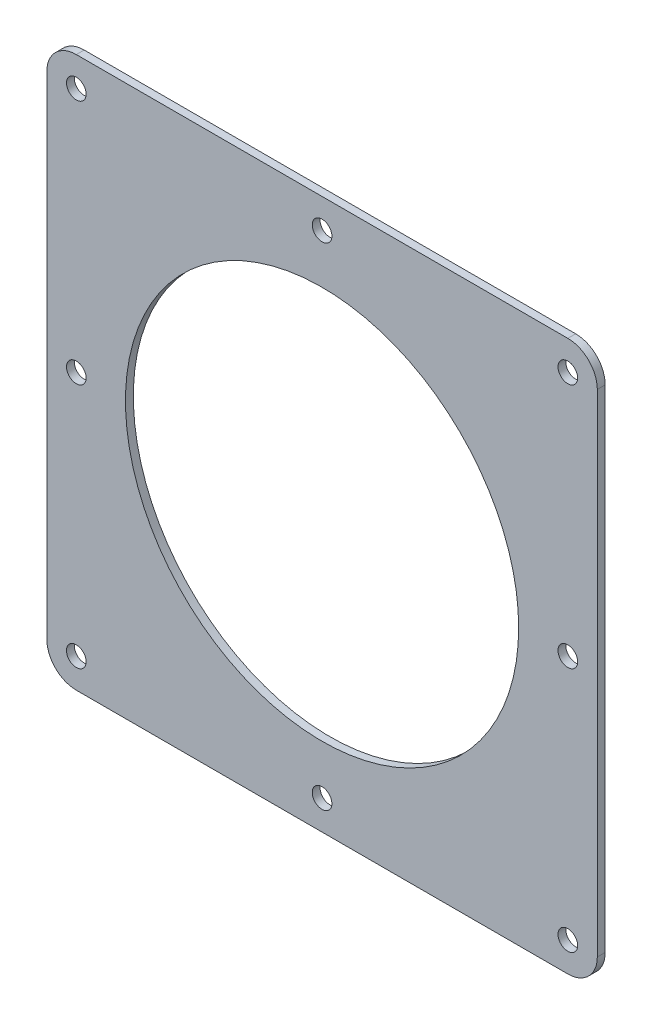
ISO-10303-21;
HEADER;
FILE_DESCRIPTION(('STEP AP214'),'2;1');
FILE_NAME('part.step','',(''),(''),'','','');
FILE_SCHEMA(('AUTOMOTIVE_DESIGN { 1 0 10303 214 1 1 1 1 }'));
ENDSEC;
DATA;
#1=APPLICATION_CONTEXT('core data for automotive mechanical design processes');
#2=APPLICATION_PROTOCOL_DEFINITION('international standard','automotive_design',2000,#1);
#3=PRODUCT_CONTEXT('',#1,'mechanical');
#4=PRODUCT('Part','Part','',(#3));
#5=PRODUCT_RELATED_PRODUCT_CATEGORY('part','',(#4));
#6=PRODUCT_DEFINITION_FORMATION('','',#4);
#7=PRODUCT_DEFINITION_CONTEXT('part definition',#1,'design');
#8=PRODUCT_DEFINITION('design','',#6,#7);
#9=PRODUCT_DEFINITION_SHAPE('','',#8);
#10=(LENGTH_UNIT() NAMED_UNIT(*) SI_UNIT(.MILLI.,.METRE.));
#11=(NAMED_UNIT(*) PLANE_ANGLE_UNIT() SI_UNIT($,.RADIAN.));
#12=(NAMED_UNIT(*) SI_UNIT($,.STERADIAN.) SOLID_ANGLE_UNIT());
#13=UNCERTAINTY_MEASURE_WITH_UNIT(LENGTH_MEASURE(1.E-05),#10,'distance_accuracy_value','');
#14=(GEOMETRIC_REPRESENTATION_CONTEXT(3) GLOBAL_UNCERTAINTY_ASSIGNED_CONTEXT((#13)) GLOBAL_UNIT_ASSIGNED_CONTEXT((#10,
#11,#12)) REPRESENTATION_CONTEXT('',''));
#15=CARTESIAN_POINT('',(0.,0.,0.));
#16=DIRECTION('',(0.,0.,1.));
#17=DIRECTION('',(1.,0.,0.));
#18=AXIS2_PLACEMENT_3D('',#15,#16,#17);
#19=CARTESIAN_POINT('',(-125.,-125.,4.));
#20=DIRECTION('',(0.,0.,1.));
#21=DIRECTION('',(1.,0.,0.));
#22=AXIS2_PLACEMENT_3D('',#19,#20,#21);
#23=PLANE('',#22);
#24=CARTESIAN_POINT('',(0.,0.,4.));
#25=DIRECTION('',(0.,0.,1.));
#26=DIRECTION('',(1.,0.,0.));
#27=AXIS2_PLACEMENT_3D('',#24,#25,#26);
#28=CIRCLE('',#27,100.);
#29=CARTESIAN_POINT('',(100.,0.,4.));
#30=VERTEX_POINT('',#29);
#31=EDGE_CURVE('E228',#30,#30,#28,.T.);
#32=ORIENTED_EDGE('',*,*,#31,.F.);
#33=EDGE_LOOP('',(#32));
#34=FACE_BOUND('',#33,.T.);
#35=CARTESIAN_POINT('',(0.,-125.,4.));
#36=DIRECTION('',(0.,0.,1.));
#37=DIRECTION('',(1.,0.,0.));
#38=AXIS2_PLACEMENT_3D('',#35,#36,#37);
#39=CIRCLE('',#38,5.);
#40=CARTESIAN_POINT('',(5.,-125.,4.));
#41=VERTEX_POINT('',#40);
#42=EDGE_CURVE('E214',#41,#41,#39,.T.);
#43=ORIENTED_EDGE('',*,*,#42,.F.);
#44=EDGE_LOOP('',(#43));
#45=FACE_BOUND('',#44,.T.);
#46=CARTESIAN_POINT('',(125.,0.,4.));
#47=DIRECTION('',(0.,0.,1.));
#48=DIRECTION('',(1.,0.,0.));
#49=AXIS2_PLACEMENT_3D('',#46,#47,#48);
#50=CIRCLE('',#49,5.00000000000001);
#51=CARTESIAN_POINT('',(130.,0.,4.));
#52=VERTEX_POINT('',#51);
#53=EDGE_CURVE('E196',#52,#52,#50,.T.);
#54=ORIENTED_EDGE('',*,*,#53,.F.);
#55=EDGE_LOOP('',(#54));
#56=FACE_BOUND('',#55,.T.);
#57=CARTESIAN_POINT('',(0.,125.,4.));
#58=DIRECTION('',(0.,0.,1.));
#59=DIRECTION('',(1.,0.,0.));
#60=AXIS2_PLACEMENT_3D('',#57,#58,#59);
#61=CIRCLE('',#60,5.);
#62=CARTESIAN_POINT('',(4.99999999999999,125.,4.));
#63=VERTEX_POINT('',#62);
#64=EDGE_CURVE('E184',#63,#63,#61,.T.);
#65=ORIENTED_EDGE('',*,*,#64,.F.);
#66=EDGE_LOOP('',(#65));
#67=FACE_BOUND('',#66,.T.);
#68=CARTESIAN_POINT('',(-125.,-125.,4.));
#69=DIRECTION('',(0.,0.,1.));
#70=DIRECTION('',(1.,0.,0.));
#71=AXIS2_PLACEMENT_3D('',#68,#69,#70);
#72=CIRCLE('',#71,15.);
#73=CARTESIAN_POINT('',(-140.,-125.,4.));
#74=VERTEX_POINT('',#73);
#75=CARTESIAN_POINT('',(-125.,-140.,4.));
#76=VERTEX_POINT('',#75);
#77=EDGE_CURVE('E146',#74,#76,#72,.T.);
#78=ORIENTED_EDGE('',*,*,#77,.T.);
#79=DIRECTION('',(1.,0.,0.));
#80=VECTOR('',#79,1.);
#81=CARTESIAN_POINT('',(-125.,-140.,4.));
#82=LINE('',#81,#80);
#83=CARTESIAN_POINT('',(125.,-140.,4.));
#84=VERTEX_POINT('',#83);
#85=EDGE_CURVE('E94',#76,#84,#82,.T.);
#86=ORIENTED_EDGE('',*,*,#85,.T.);
#87=CARTESIAN_POINT('',(125.,-125.,4.));
#88=DIRECTION('',(0.,0.,1.));
#89=DIRECTION('',(1.,0.,0.));
#90=AXIS2_PLACEMENT_3D('',#87,#88,#89);
#91=CIRCLE('',#90,15.);
#92=CARTESIAN_POINT('',(140.,-125.,4.));
#93=VERTEX_POINT('',#92);
#94=EDGE_CURVE('E162',#84,#93,#91,.T.);
#95=ORIENTED_EDGE('',*,*,#94,.T.);
#96=DIRECTION('',(0.,1.,0.));
#97=VECTOR('',#96,1.);
#98=CARTESIAN_POINT('',(140.,125.,4.));
#99=LINE('',#98,#97);
#100=CARTESIAN_POINT('',(140.,125.,4.));
#101=VERTEX_POINT('',#100);
#102=EDGE_CURVE('E175',#93,#101,#99,.T.);
#103=ORIENTED_EDGE('',*,*,#102,.T.);
#104=CARTESIAN_POINT('',(125.,125.,4.));
#105=DIRECTION('',(0.,0.,1.));
#106=DIRECTION('',(-1.,0.,0.));
#107=AXIS2_PLACEMENT_3D('',#104,#105,#106);
#108=CIRCLE('',#107,15.);
#109=CARTESIAN_POINT('',(125.,140.,4.));
#110=VERTEX_POINT('',#109);
#111=EDGE_CURVE('E113',#101,#110,#108,.T.);
#112=ORIENTED_EDGE('',*,*,#111,.T.);
#113=DIRECTION('',(-1.,0.,0.));
#114=VECTOR('',#113,1.);
#115=CARTESIAN_POINT('',(-125.,140.,4.));
#116=LINE('',#115,#114);
#117=CARTESIAN_POINT('',(-125.,140.,4.));
#118=VERTEX_POINT('',#117);
#119=EDGE_CURVE('E107',#110,#118,#116,.T.);
#120=ORIENTED_EDGE('',*,*,#119,.T.);
#121=CARTESIAN_POINT('',(-125.,125.,4.));
#122=DIRECTION('',(0.,0.,1.));
#123=DIRECTION('',(1.,0.,0.));
#124=AXIS2_PLACEMENT_3D('',#121,#122,#123);
#125=CIRCLE('',#124,15.);
#126=CARTESIAN_POINT('',(-140.,125.,4.));
#127=VERTEX_POINT('',#126);
#128=EDGE_CURVE('E111',#118,#127,#125,.T.);
#129=ORIENTED_EDGE('',*,*,#128,.T.);
#130=DIRECTION('',(0.,-1.,0.));
#131=VECTOR('',#130,1.);
#132=CARTESIAN_POINT('',(-140.,125.,4.));
#133=LINE('',#132,#131);
#134=EDGE_CURVE('E51',#127,#74,#133,.T.);
#135=ORIENTED_EDGE('',*,*,#134,.T.);
#136=EDGE_LOOP('',(#78,#86,#95,#103,#112,#120,#129,#135));
#137=FACE_BOUND('',#136,.T.);
#138=CARTESIAN_POINT('',(-125.,125.,4.));
#139=DIRECTION('',(0.,0.,1.));
#140=DIRECTION('',(1.,0.,0.));
#141=AXIS2_PLACEMENT_3D('',#138,#139,#140);
#142=CIRCLE('',#141,5.00000000000001);
#143=CARTESIAN_POINT('',(-120.,125.,4.));
#144=VERTEX_POINT('',#143);
#145=EDGE_CURVE('E135',#144,#144,#142,.T.);
#146=ORIENTED_EDGE('',*,*,#145,.F.);
#147=EDGE_LOOP('',(#146));
#148=FACE_BOUND('',#147,.T.);
#149=CARTESIAN_POINT('',(125.,125.,4.));
#150=DIRECTION('',(0.,0.,1.));
#151=DIRECTION('',(1.,0.,0.));
#152=AXIS2_PLACEMENT_3D('',#149,#150,#151);
#153=CIRCLE('',#152,4.99999999999999);
#154=CARTESIAN_POINT('',(130.,125.,4.));
#155=VERTEX_POINT('',#154);
#156=EDGE_CURVE('E190',#155,#155,#153,.T.);
#157=ORIENTED_EDGE('',*,*,#156,.F.);
#158=EDGE_LOOP('',(#157));
#159=FACE_BOUND('',#158,.T.);
#160=CARTESIAN_POINT('',(-125.,0.,4.));
#161=DIRECTION('',(0.,0.,1.));
#162=DIRECTION('',(1.,0.,0.));
#163=AXIS2_PLACEMENT_3D('',#160,#161,#162);
#164=CIRCLE('',#163,5.);
#165=CARTESIAN_POINT('',(-120.,0.,4.));
#166=VERTEX_POINT('',#165);
#167=EDGE_CURVE('E202',#166,#166,#164,.T.);
#168=ORIENTED_EDGE('',*,*,#167,.F.);
#169=EDGE_LOOP('',(#168));
#170=FACE_BOUND('',#169,.T.);
#171=CARTESIAN_POINT('',(-125.,-125.,4.));
#172=DIRECTION('',(0.,0.,1.));
#173=DIRECTION('',(1.,0.,0.));
#174=AXIS2_PLACEMENT_3D('',#171,#172,#173);
#175=CIRCLE('',#174,5.00000000000001);
#176=CARTESIAN_POINT('',(-120.,-125.,4.));
#177=VERTEX_POINT('',#176);
#178=EDGE_CURVE('E208',#177,#177,#175,.T.);
#179=ORIENTED_EDGE('',*,*,#178,.F.);
#180=EDGE_LOOP('',(#179));
#181=FACE_BOUND('',#180,.T.);
#182=CARTESIAN_POINT('',(125.,-125.,4.));
#183=DIRECTION('',(0.,0.,1.));
#184=DIRECTION('',(1.,0.,0.));
#185=AXIS2_PLACEMENT_3D('',#182,#183,#184);
#186=CIRCLE('',#185,5.00000000000002);
#187=CARTESIAN_POINT('',(130.,-125.,4.));
#188=VERTEX_POINT('',#187);
#189=EDGE_CURVE('E220',#188,#188,#186,.T.);
#190=ORIENTED_EDGE('',*,*,#189,.F.);
#191=EDGE_LOOP('',(#190));
#192=FACE_BOUND('',#191,.T.);
#193=ADVANCED_FACE('F33',(#34,#45,#56,#67,#137,#148,#159,#170,#181,#192),#23,.T.);
#194=CARTESIAN_POINT('',(-125.,-125.,0.));
#195=DIRECTION('',(0.,0.,1.));
#196=DIRECTION('',(1.,0.,0.));
#197=AXIS2_PLACEMENT_3D('',#194,#195,#196);
#198=PLANE('',#197);
#199=CARTESIAN_POINT('',(0.,0.,0.));
#200=DIRECTION('',(0.,0.,1.));
#201=DIRECTION('',(1.,0.,0.));
#202=AXIS2_PLACEMENT_3D('',#199,#200,#201);
#203=CIRCLE('',#202,100.);
#204=CARTESIAN_POINT('',(100.,0.,0.));
#205=VERTEX_POINT('',#204);
#206=EDGE_CURVE('E37',#205,#205,#203,.T.);
#207=ORIENTED_EDGE('',*,*,#206,.T.);
#208=EDGE_LOOP('',(#207));
#209=FACE_BOUND('',#208,.T.);
#210=CARTESIAN_POINT('',(-125.,-125.,0.));
#211=DIRECTION('',(0.,0.,1.));
#212=DIRECTION('',(1.,0.,0.));
#213=AXIS2_PLACEMENT_3D('',#210,#211,#212);
#214=CIRCLE('',#213,15.);
#215=CARTESIAN_POINT('',(-140.,-125.,0.));
#216=VERTEX_POINT('',#215);
#217=CARTESIAN_POINT('',(-125.,-140.,0.));
#218=VERTEX_POINT('',#217);
#219=EDGE_CURVE('E131',#216,#218,#214,.T.);
#220=ORIENTED_EDGE('',*,*,#219,.F.);
#221=DIRECTION('',(0.,-1.,0.));
#222=VECTOR('',#221,1.);
#223=CARTESIAN_POINT('',(-140.,125.,0.));
#224=LINE('',#223,#222);
#225=CARTESIAN_POINT('',(-140.,125.,0.));
#226=VERTEX_POINT('',#225);
#227=EDGE_CURVE('E86',#226,#216,#224,.T.);
#228=ORIENTED_EDGE('',*,*,#227,.F.);
#229=CARTESIAN_POINT('',(-125.,125.,0.));
#230=DIRECTION('',(0.,0.,1.));
#231=DIRECTION('',(1.,0.,0.));
#232=AXIS2_PLACEMENT_3D('',#229,#230,#231);
#233=CIRCLE('',#232,15.);
#234=CARTESIAN_POINT('',(-125.,140.,0.));
#235=VERTEX_POINT('',#234);
#236=EDGE_CURVE('E80',#235,#226,#233,.T.);
#237=ORIENTED_EDGE('',*,*,#236,.F.);
#238=DIRECTION('',(-1.,0.,0.));
#239=VECTOR('',#238,1.);
#240=CARTESIAN_POINT('',(-125.,140.,0.));
#241=LINE('',#240,#239);
#242=CARTESIAN_POINT('',(125.,140.,0.));
#243=VERTEX_POINT('',#242);
#244=EDGE_CURVE('E121',#243,#235,#241,.T.);
#245=ORIENTED_EDGE('',*,*,#244,.F.);
#246=CARTESIAN_POINT('',(125.,125.,0.));
#247=DIRECTION('',(0.,0.,1.));
#248=DIRECTION('',(-1.,0.,0.));
#249=AXIS2_PLACEMENT_3D('',#246,#247,#248);
#250=CIRCLE('',#249,15.);
#251=CARTESIAN_POINT('',(140.,125.,0.));
#252=VERTEX_POINT('',#251);
#253=EDGE_CURVE('E141',#252,#243,#250,.T.);
#254=ORIENTED_EDGE('',*,*,#253,.F.);
#255=DIRECTION('',(0.,1.,0.));
#256=VECTOR('',#255,1.);
#257=CARTESIAN_POINT('',(140.,125.,0.));
#258=LINE('',#257,#256);
#259=CARTESIAN_POINT('',(140.,-125.,0.));
#260=VERTEX_POINT('',#259);
#261=EDGE_CURVE('E139',#260,#252,#258,.T.);
#262=ORIENTED_EDGE('',*,*,#261,.F.);
#263=CARTESIAN_POINT('',(125.,-125.,0.));
#264=DIRECTION('',(0.,0.,1.));
#265=DIRECTION('',(1.,0.,0.));
#266=AXIS2_PLACEMENT_3D('',#263,#264,#265);
#267=CIRCLE('',#266,15.);
#268=CARTESIAN_POINT('',(125.,-140.,0.));
#269=VERTEX_POINT('',#268);
#270=EDGE_CURVE('E137',#269,#260,#267,.T.);
#271=ORIENTED_EDGE('',*,*,#270,.F.);
#272=DIRECTION('',(1.,0.,0.));
#273=VECTOR('',#272,1.);
#274=CARTESIAN_POINT('',(-125.,-140.,0.));
#275=LINE('',#274,#273);
#276=EDGE_CURVE('E134',#218,#269,#275,.T.);
#277=ORIENTED_EDGE('',*,*,#276,.F.);
#278=EDGE_LOOP('',(#220,#228,#237,#245,#254,#262,#271,#277));
#279=FACE_BOUND('',#278,.T.);
#280=CARTESIAN_POINT('',(-125.,125.,0.));
#281=DIRECTION('',(0.,0.,1.));
#282=DIRECTION('',(1.,0.,0.));
#283=AXIS2_PLACEMENT_3D('',#280,#281,#282);
#284=CIRCLE('',#283,5.00000000000001);
#285=CARTESIAN_POINT('',(-120.,125.,0.));
#286=VERTEX_POINT('',#285);
#287=EDGE_CURVE('E181',#286,#286,#284,.T.);
#288=ORIENTED_EDGE('',*,*,#287,.T.);
#289=EDGE_LOOP('',(#288));
#290=FACE_BOUND('',#289,.T.);
#291=CARTESIAN_POINT('',(0.,125.,0.));
#292=DIRECTION('',(0.,0.,1.));
#293=DIRECTION('',(1.,0.,0.));
#294=AXIS2_PLACEMENT_3D('',#291,#292,#293);
#295=CIRCLE('',#294,5.);
#296=CARTESIAN_POINT('',(4.99999999999999,125.,0.));
#297=VERTEX_POINT('',#296);
#298=EDGE_CURVE('E187',#297,#297,#295,.T.);
#299=ORIENTED_EDGE('',*,*,#298,.T.);
#300=EDGE_LOOP('',(#299));
#301=FACE_BOUND('',#300,.T.);
#302=CARTESIAN_POINT('',(125.,125.,0.));
#303=DIRECTION('',(0.,0.,1.));
#304=DIRECTION('',(1.,0.,0.));
#305=AXIS2_PLACEMENT_3D('',#302,#303,#304);
#306=CIRCLE('',#305,4.99999999999999);
#307=CARTESIAN_POINT('',(130.,125.,0.));
#308=VERTEX_POINT('',#307);
#309=EDGE_CURVE('E193',#308,#308,#306,.T.);
#310=ORIENTED_EDGE('',*,*,#309,.T.);
#311=EDGE_LOOP('',(#310));
#312=FACE_BOUND('',#311,.T.);
#313=CARTESIAN_POINT('',(125.,0.,0.));
#314=DIRECTION('',(0.,0.,1.));
#315=DIRECTION('',(1.,0.,0.));
#316=AXIS2_PLACEMENT_3D('',#313,#314,#315);
#317=CIRCLE('',#316,5.00000000000001);
#318=CARTESIAN_POINT('',(130.,0.,0.));
#319=VERTEX_POINT('',#318);
#320=EDGE_CURVE('E199',#319,#319,#317,.T.);
#321=ORIENTED_EDGE('',*,*,#320,.T.);
#322=EDGE_LOOP('',(#321));
#323=FACE_BOUND('',#322,.T.);
#324=CARTESIAN_POINT('',(-125.,0.,0.));
#325=DIRECTION('',(0.,0.,1.));
#326=DIRECTION('',(1.,0.,0.));
#327=AXIS2_PLACEMENT_3D('',#324,#325,#326);
#328=CIRCLE('',#327,5.);
#329=CARTESIAN_POINT('',(-120.,0.,0.));
#330=VERTEX_POINT('',#329);
#331=EDGE_CURVE('E205',#330,#330,#328,.T.);
#332=ORIENTED_EDGE('',*,*,#331,.T.);
#333=EDGE_LOOP('',(#332));
#334=FACE_BOUND('',#333,.T.);
#335=CARTESIAN_POINT('',(-125.,-125.,0.));
#336=DIRECTION('',(0.,0.,1.));
#337=DIRECTION('',(1.,0.,0.));
#338=AXIS2_PLACEMENT_3D('',#335,#336,#337);
#339=CIRCLE('',#338,5.00000000000001);
#340=CARTESIAN_POINT('',(-120.,-125.,0.));
#341=VERTEX_POINT('',#340);
#342=EDGE_CURVE('E211',#341,#341,#339,.T.);
#343=ORIENTED_EDGE('',*,*,#342,.T.);
#344=EDGE_LOOP('',(#343));
#345=FACE_BOUND('',#344,.T.);
#346=CARTESIAN_POINT('',(0.,-125.,0.));
#347=DIRECTION('',(0.,0.,1.));
#348=DIRECTION('',(1.,0.,0.));
#349=AXIS2_PLACEMENT_3D('',#346,#347,#348);
#350=CIRCLE('',#349,5.);
#351=CARTESIAN_POINT('',(5.,-125.,0.));
#352=VERTEX_POINT('',#351);
#353=EDGE_CURVE('E217',#352,#352,#350,.T.);
#354=ORIENTED_EDGE('',*,*,#353,.T.);
#355=EDGE_LOOP('',(#354));
#356=FACE_BOUND('',#355,.T.);
#357=CARTESIAN_POINT('',(125.,-125.,0.));
#358=DIRECTION('',(0.,0.,1.));
#359=DIRECTION('',(1.,0.,0.));
#360=AXIS2_PLACEMENT_3D('',#357,#358,#359);
#361=CIRCLE('',#360,5.00000000000002);
#362=CARTESIAN_POINT('',(130.,-125.,0.));
#363=VERTEX_POINT('',#362);
#364=EDGE_CURVE('E223',#363,#363,#361,.T.);
#365=ORIENTED_EDGE('',*,*,#364,.T.);
#366=EDGE_LOOP('',(#365));
#367=FACE_BOUND('',#366,.T.);
#368=ADVANCED_FACE('F166',(#209,#279,#290,#301,#312,#323,#334,#345,#356,#367),#198,.F.);
#369=CARTESIAN_POINT('',(-125.,-125.,4.));
#370=DIRECTION('',(0.,0.,-1.));
#371=DIRECTION('',(-1.,0.,0.));
#372=AXIS2_PLACEMENT_3D('',#369,#370,#371);
#373=CYLINDRICAL_SURFACE('',#372,15.);
#374=ORIENTED_EDGE('',*,*,#219,.T.);
#375=DIRECTION('',(0.,0.,-1.));
#376=VECTOR('',#375,1.);
#377=CARTESIAN_POINT('',(-125.,-140.,4.));
#378=LINE('',#377,#376);
#379=EDGE_CURVE('E11',#76,#218,#378,.T.);
#380=ORIENTED_EDGE('',*,*,#379,.F.);
#381=ORIENTED_EDGE('',*,*,#77,.F.);
#382=DIRECTION('',(0.,0.,-1.));
#383=VECTOR('',#382,1.);
#384=CARTESIAN_POINT('',(-140.,-125.,4.));
#385=LINE('',#384,#383);
#386=EDGE_CURVE('E127',#74,#216,#385,.T.);
#387=ORIENTED_EDGE('',*,*,#386,.T.);
#388=EDGE_LOOP('',(#374,#380,#381,#387));
#389=FACE_BOUND('',#388,.T.);
#390=ADVANCED_FACE('F35',(#389),#373,.T.);
#391=CARTESIAN_POINT('',(-125.,-140.,4.));
#392=DIRECTION('',(0.,1.,0.));
#393=DIRECTION('',(0.,0.,1.));
#394=AXIS2_PLACEMENT_3D('',#391,#392,#393);
#395=PLANE('',#394);
#396=ORIENTED_EDGE('',*,*,#276,.T.);
#397=DIRECTION('',(0.,0.,-1.));
#398=VECTOR('',#397,1.);
#399=CARTESIAN_POINT('',(125.,-140.,4.));
#400=LINE('',#399,#398);
#401=EDGE_CURVE('E43',#84,#269,#400,.T.);
#402=ORIENTED_EDGE('',*,*,#401,.F.);
#403=ORIENTED_EDGE('',*,*,#85,.F.);
#404=ORIENTED_EDGE('',*,*,#379,.T.);
#405=EDGE_LOOP('',(#396,#402,#403,#404));
#406=FACE_BOUND('',#405,.T.);
#407=ADVANCED_FACE('F270',(#406),#395,.F.);
#408=CARTESIAN_POINT('',(125.,-125.,4.));
#409=DIRECTION('',(0.,0.,-1.));
#410=DIRECTION('',(-1.,0.,0.));
#411=AXIS2_PLACEMENT_3D('',#408,#409,#410);
#412=CYLINDRICAL_SURFACE('',#411,15.);
#413=ORIENTED_EDGE('',*,*,#270,.T.);
#414=DIRECTION('',(0.,0.,-1.));
#415=VECTOR('',#414,1.);
#416=CARTESIAN_POINT('',(140.,-125.,4.));
#417=LINE('',#416,#415);
#418=EDGE_CURVE('E153',#93,#260,#417,.T.);
#419=ORIENTED_EDGE('',*,*,#418,.F.);
#420=ORIENTED_EDGE('',*,*,#94,.F.);
#421=ORIENTED_EDGE('',*,*,#401,.T.);
#422=EDGE_LOOP('',(#413,#419,#420,#421));
#423=FACE_BOUND('',#422,.T.);
#424=ADVANCED_FACE('F160',(#423),#412,.T.);
#425=CARTESIAN_POINT('',(140.,125.,4.));
#426=DIRECTION('',(-1.,0.,0.));
#427=DIRECTION('',(0.,0.,1.));
#428=AXIS2_PLACEMENT_3D('',#425,#426,#427);
#429=PLANE('',#428);
#430=ORIENTED_EDGE('',*,*,#261,.T.);
#431=DIRECTION('',(0.,0.,-1.));
#432=VECTOR('',#431,1.);
#433=CARTESIAN_POINT('',(140.,125.,4.));
#434=LINE('',#433,#432);
#435=EDGE_CURVE('E150',#101,#252,#434,.T.);
#436=ORIENTED_EDGE('',*,*,#435,.F.);
#437=ORIENTED_EDGE('',*,*,#102,.F.);
#438=ORIENTED_EDGE('',*,*,#418,.T.);
#439=EDGE_LOOP('',(#430,#436,#437,#438));
#440=FACE_BOUND('',#439,.T.);
#441=ADVANCED_FACE('F171',(#440),#429,.F.);
#442=CARTESIAN_POINT('',(125.,125.,4.));
#443=DIRECTION('',(0.,0.,-1.));
#444=DIRECTION('',(-1.,0.,0.));
#445=AXIS2_PLACEMENT_3D('',#442,#443,#444);
#446=CYLINDRICAL_SURFACE('',#445,15.);
#447=ORIENTED_EDGE('',*,*,#253,.T.);
#448=DIRECTION('',(0.,0.,-1.));
#449=VECTOR('',#448,1.);
#450=CARTESIAN_POINT('',(125.,140.,4.));
#451=LINE('',#450,#449);
#452=EDGE_CURVE('E122',#110,#243,#451,.T.);
#453=ORIENTED_EDGE('',*,*,#452,.F.);
#454=ORIENTED_EDGE('',*,*,#111,.F.);
#455=ORIENTED_EDGE('',*,*,#435,.T.);
#456=EDGE_LOOP('',(#447,#453,#454,#455));
#457=FACE_BOUND('',#456,.T.);
#458=ADVANCED_FACE('F174',(#457),#446,.T.);
#459=CARTESIAN_POINT('',(-125.,140.,4.));
#460=DIRECTION('',(0.,-1.,0.));
#461=DIRECTION('',(0.,0.,-1.));
#462=AXIS2_PLACEMENT_3D('',#459,#460,#461);
#463=PLANE('',#462);
#464=ORIENTED_EDGE('',*,*,#244,.T.);
#465=DIRECTION('',(0.,0.,-1.));
#466=VECTOR('',#465,1.);
#467=CARTESIAN_POINT('',(-125.,140.,4.));
#468=LINE('',#467,#466);
#469=EDGE_CURVE('E118',#118,#235,#468,.T.);
#470=ORIENTED_EDGE('',*,*,#469,.F.);
#471=ORIENTED_EDGE('',*,*,#119,.F.);
#472=ORIENTED_EDGE('',*,*,#452,.T.);
#473=EDGE_LOOP('',(#464,#470,#471,#472));
#474=FACE_BOUND('',#473,.T.);
#475=ADVANCED_FACE('F119',(#474),#463,.F.);
#476=CARTESIAN_POINT('',(-125.,125.,4.));
#477=DIRECTION('',(0.,0.,-1.));
#478=DIRECTION('',(-1.,0.,0.));
#479=AXIS2_PLACEMENT_3D('',#476,#477,#478);
#480=CYLINDRICAL_SURFACE('',#479,15.);
#481=ORIENTED_EDGE('',*,*,#236,.T.);
#482=DIRECTION('',(0.,0.,-1.));
#483=VECTOR('',#482,1.);
#484=CARTESIAN_POINT('',(-140.,125.,4.));
#485=LINE('',#484,#483);
#486=EDGE_CURVE('E123',#127,#226,#485,.T.);
#487=ORIENTED_EDGE('',*,*,#486,.F.);
#488=ORIENTED_EDGE('',*,*,#128,.F.);
#489=ORIENTED_EDGE('',*,*,#469,.T.);
#490=EDGE_LOOP('',(#481,#487,#488,#489));
#491=FACE_BOUND('',#490,.T.);
#492=ADVANCED_FACE('F125',(#491),#480,.T.);
#493=CARTESIAN_POINT('',(-140.,125.,4.));
#494=DIRECTION('',(1.,0.,0.));
#495=DIRECTION('',(0.,0.,-1.));
#496=AXIS2_PLACEMENT_3D('',#493,#494,#495);
#497=PLANE('',#496);
#498=ORIENTED_EDGE('',*,*,#227,.T.);
#499=ORIENTED_EDGE('',*,*,#386,.F.);
#500=ORIENTED_EDGE('',*,*,#134,.F.);
#501=ORIENTED_EDGE('',*,*,#486,.T.);
#502=EDGE_LOOP('',(#498,#499,#500,#501));
#503=FACE_BOUND('',#502,.T.);
#504=ADVANCED_FACE('F258',(#503),#497,.F.);
#505=CARTESIAN_POINT('',(-125.,125.,4.));
#506=DIRECTION('',(0.,0.,-1.));
#507=DIRECTION('',(-1.,0.,0.));
#508=AXIS2_PLACEMENT_3D('',#505,#506,#507);
#509=CYLINDRICAL_SURFACE('',#508,5.00000000000001);
#510=ORIENTED_EDGE('',*,*,#145,.T.);
#511=EDGE_LOOP('',(#510));
#512=FACE_BOUND('',#511,.T.);
#513=ORIENTED_EDGE('',*,*,#287,.F.);
#514=EDGE_LOOP('',(#513));
#515=FACE_BOUND('',#514,.T.);
#516=ADVANCED_FACE('F255',(#512,#515),#509,.F.);
#517=CARTESIAN_POINT('',(0.,125.,4.));
#518=DIRECTION('',(0.,0.,-1.));
#519=DIRECTION('',(-1.,0.,0.));
#520=AXIS2_PLACEMENT_3D('',#517,#518,#519);
#521=CYLINDRICAL_SURFACE('',#520,5.);
#522=ORIENTED_EDGE('',*,*,#64,.T.);
#523=EDGE_LOOP('',(#522));
#524=FACE_BOUND('',#523,.T.);
#525=ORIENTED_EDGE('',*,*,#298,.F.);
#526=EDGE_LOOP('',(#525));
#527=FACE_BOUND('',#526,.T.);
#528=ADVANCED_FACE('F341',(#524,#527),#521,.F.);
#529=CARTESIAN_POINT('',(125.,125.,4.));
#530=DIRECTION('',(0.,0.,-1.));
#531=DIRECTION('',(-1.,0.,0.));
#532=AXIS2_PLACEMENT_3D('',#529,#530,#531);
#533=CYLINDRICAL_SURFACE('',#532,4.99999999999999);
#534=ORIENTED_EDGE('',*,*,#156,.T.);
#535=EDGE_LOOP('',(#534));
#536=FACE_BOUND('',#535,.T.);
#537=ORIENTED_EDGE('',*,*,#309,.F.);
#538=EDGE_LOOP('',(#537));
#539=FACE_BOUND('',#538,.T.);
#540=ADVANCED_FACE('F332',(#536,#539),#533,.F.);
#541=CARTESIAN_POINT('',(125.,0.,4.));
#542=DIRECTION('',(0.,0.,-1.));
#543=DIRECTION('',(-1.,0.,0.));
#544=AXIS2_PLACEMENT_3D('',#541,#542,#543);
#545=CYLINDRICAL_SURFACE('',#544,5.00000000000001);
#546=ORIENTED_EDGE('',*,*,#53,.T.);
#547=EDGE_LOOP('',(#546));
#548=FACE_BOUND('',#547,.T.);
#549=ORIENTED_EDGE('',*,*,#320,.F.);
#550=EDGE_LOOP('',(#549));
#551=FACE_BOUND('',#550,.T.);
#552=ADVANCED_FACE('F323',(#548,#551),#545,.F.);
#553=CARTESIAN_POINT('',(-125.,0.,4.));
#554=DIRECTION('',(0.,0.,-1.));
#555=DIRECTION('',(-1.,0.,0.));
#556=AXIS2_PLACEMENT_3D('',#553,#554,#555);
#557=CYLINDRICAL_SURFACE('',#556,5.);
#558=ORIENTED_EDGE('',*,*,#167,.T.);
#559=EDGE_LOOP('',(#558));
#560=FACE_BOUND('',#559,.T.);
#561=ORIENTED_EDGE('',*,*,#331,.F.);
#562=EDGE_LOOP('',(#561));
#563=FACE_BOUND('',#562,.T.);
#564=ADVANCED_FACE('F314',(#560,#563),#557,.F.);
#565=CARTESIAN_POINT('',(-125.,-125.,4.));
#566=DIRECTION('',(0.,0.,-1.));
#567=DIRECTION('',(-1.,0.,0.));
#568=AXIS2_PLACEMENT_3D('',#565,#566,#567);
#569=CYLINDRICAL_SURFACE('',#568,5.00000000000001);
#570=ORIENTED_EDGE('',*,*,#178,.T.);
#571=EDGE_LOOP('',(#570));
#572=FACE_BOUND('',#571,.T.);
#573=ORIENTED_EDGE('',*,*,#342,.F.);
#574=EDGE_LOOP('',(#573));
#575=FACE_BOUND('',#574,.T.);
#576=ADVANCED_FACE('F305',(#572,#575),#569,.F.);
#577=CARTESIAN_POINT('',(0.,-125.,4.));
#578=DIRECTION('',(0.,0.,-1.));
#579=DIRECTION('',(-1.,0.,0.));
#580=AXIS2_PLACEMENT_3D('',#577,#578,#579);
#581=CYLINDRICAL_SURFACE('',#580,5.);
#582=ORIENTED_EDGE('',*,*,#42,.T.);
#583=EDGE_LOOP('',(#582));
#584=FACE_BOUND('',#583,.T.);
#585=ORIENTED_EDGE('',*,*,#353,.F.);
#586=EDGE_LOOP('',(#585));
#587=FACE_BOUND('',#586,.T.);
#588=ADVANCED_FACE('F243',(#584,#587),#581,.F.);
#589=CARTESIAN_POINT('',(125.,-125.,4.));
#590=DIRECTION('',(0.,0.,-1.));
#591=DIRECTION('',(-1.,0.,0.));
#592=AXIS2_PLACEMENT_3D('',#589,#590,#591);
#593=CYLINDRICAL_SURFACE('',#592,5.00000000000002);
#594=ORIENTED_EDGE('',*,*,#189,.T.);
#595=EDGE_LOOP('',(#594));
#596=FACE_BOUND('',#595,.T.);
#597=ORIENTED_EDGE('',*,*,#364,.F.);
#598=EDGE_LOOP('',(#597));
#599=FACE_BOUND('',#598,.T.);
#600=ADVANCED_FACE('F238',(#596,#599),#593,.F.);
#601=CARTESIAN_POINT('',(0.,0.,-6.));
#602=DIRECTION('',(0.,0.,1.));
#603=DIRECTION('',(1.,0.,0.));
#604=AXIS2_PLACEMENT_3D('',#601,#602,#603);
#605=CYLINDRICAL_SURFACE('',#604,100.);
#606=ORIENTED_EDGE('',*,*,#31,.T.);
#607=EDGE_LOOP('',(#606));
#608=FACE_BOUND('',#607,.T.);
#609=ORIENTED_EDGE('',*,*,#206,.F.);
#610=EDGE_LOOP('',(#609));
#611=FACE_BOUND('',#610,.T.);
#612=ADVANCED_FACE('F236',(#608,#611),#605,.F.);
#613=CLOSED_SHELL('',(#193,#368,#390,#407,#424,#441,#458,#475,#492,#504,#516,#528,#540,#552,
#564,#576,#588,#600,#612));
#614=MANIFOLD_SOLID_BREP('B2',#613);
#615=ADVANCED_BREP_SHAPE_REPRESENTATION('',(#18,#614),#14);
#616=SHAPE_DEFINITION_REPRESENTATION(#9,#615);
ENDSEC;
END-ISO-10303-21;
